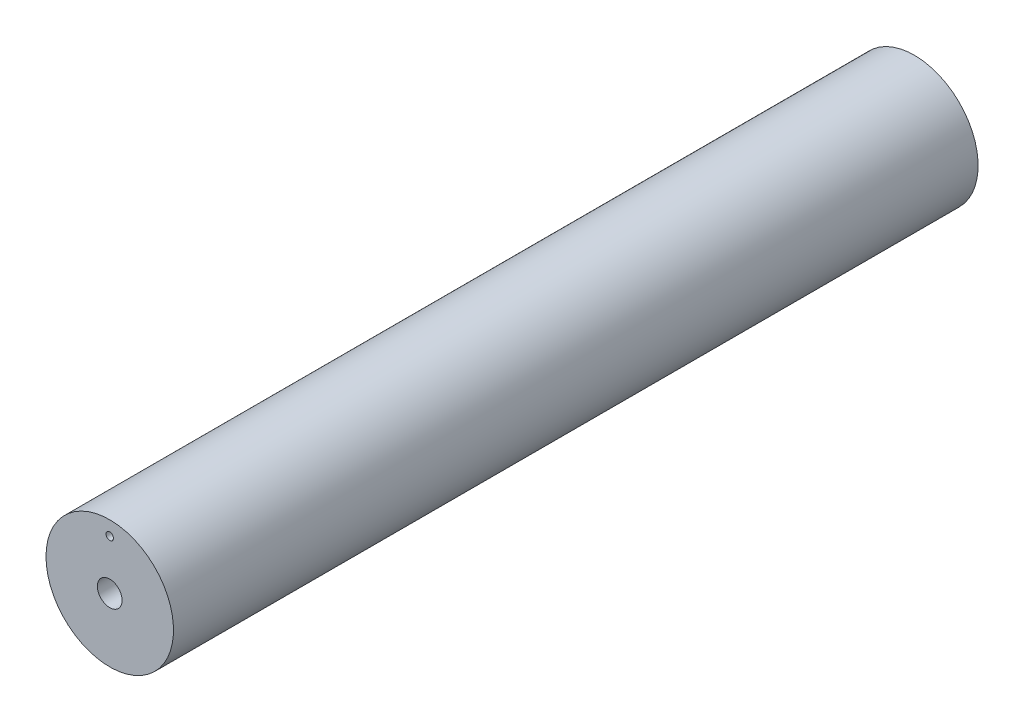
ISO-10303-21;
HEADER;
FILE_DESCRIPTION(('STEP AP214'),'2;1');
FILE_NAME('part.step','',(''),(''),'','','');
FILE_SCHEMA(('AUTOMOTIVE_DESIGN { 1 0 10303 214 1 1 1 1 }'));
ENDSEC;
DATA;
#1=APPLICATION_CONTEXT('core data for automotive mechanical design processes');
#2=APPLICATION_PROTOCOL_DEFINITION('international standard','automotive_design',2000,#1);
#3=PRODUCT_CONTEXT('',#1,'mechanical');
#4=PRODUCT('Part','Part','',(#3));
#5=PRODUCT_RELATED_PRODUCT_CATEGORY('part','',(#4));
#6=PRODUCT_DEFINITION_FORMATION('','',#4);
#7=PRODUCT_DEFINITION_CONTEXT('part definition',#1,'design');
#8=PRODUCT_DEFINITION('design','',#6,#7);
#9=PRODUCT_DEFINITION_SHAPE('','',#8);
#10=(LENGTH_UNIT() NAMED_UNIT(*) SI_UNIT(.MILLI.,.METRE.));
#11=(NAMED_UNIT(*) PLANE_ANGLE_UNIT() SI_UNIT($,.RADIAN.));
#12=(NAMED_UNIT(*) SI_UNIT($,.STERADIAN.) SOLID_ANGLE_UNIT());
#13=UNCERTAINTY_MEASURE_WITH_UNIT(LENGTH_MEASURE(1.E-05),#10,'distance_accuracy_value','');
#14=(GEOMETRIC_REPRESENTATION_CONTEXT(3) GLOBAL_UNCERTAINTY_ASSIGNED_CONTEXT((#13)) GLOBAL_UNIT_ASSIGNED_CONTEXT((#10,
#11,#12)) REPRESENTATION_CONTEXT('',''));
#15=CARTESIAN_POINT('',(0.,0.,0.));
#16=DIRECTION('',(0.,0.,1.));
#17=DIRECTION('',(1.,0.,0.));
#18=AXIS2_PLACEMENT_3D('',#15,#16,#17);
#19=CARTESIAN_POINT('',(0.,0.,-325.));
#20=DIRECTION('',(0.,0.,-1.));
#21=DIRECTION('',(-1.,0.,0.));
#22=AXIS2_PLACEMENT_3D('',#19,#20,#21);
#23=PLANE('',#22);
#24=CARTESIAN_POINT('',(0.,0.,-325.));
#25=DIRECTION('',(0.,0.,-1.));
#26=DIRECTION('',(-1.,0.,0.));
#27=AXIS2_PLACEMENT_3D('',#24,#25,#26);
#28=CIRCLE('',#27,25.75);
#29=CARTESIAN_POINT('',(-25.75,0.,-325.));
#30=VERTEX_POINT('',#29);
#31=EDGE_CURVE('E44',#30,#30,#28,.T.);
#32=ORIENTED_EDGE('',*,*,#31,.T.);
#33=EDGE_LOOP('',(#32));
#34=FACE_BOUND('',#33,.T.);
#35=ADVANCED_FACE('F34',(#34),#23,.T.);
#36=CARTESIAN_POINT('',(0.,0.,-14.8342391304348));
#37=DIRECTION('',(0.,0.,-1.));
#38=DIRECTION('',(-1.,0.,0.));
#39=AXIS2_PLACEMENT_3D('',#36,#37,#38);
#40=CYLINDRICAL_SURFACE('',#39,25.75);
#41=CARTESIAN_POINT('',(0.,-25.75,-302.5));
#42=CARTESIAN_POINT('',(-0.139071702964783,-25.7500013116466,-302.4999973531));
#43=CARTESIAN_POINT('',(-0.278109776292177,-25.7488713669522,-302.505803836122));
#44=CARTESIAN_POINT('',(-0.555227428036601,-25.7443859498667,-302.528979201853));
#45=CARTESIAN_POINT('',(-0.693306815179918,-25.7410300455616,-302.54635032851));
#46=CARTESIAN_POINT('',(-0.967538643947668,-25.7321823312999,-302.592534502752));
#47=CARTESIAN_POINT('',(-1.10369002824027,-25.7266893930699,-302.621353594603));
#48=CARTESIAN_POINT('',(-1.37307985056171,-25.7137189545468,-302.690219754531));
#49=CARTESIAN_POINT('',(-1.50631719872343,-25.7062407250305,-302.730270948612));
#50=CARTESIAN_POINT('',(-1.76871969364963,-25.6895191523797,-302.821230049703));
#51=CARTESIAN_POINT('',(-1.89788996822648,-25.6802781448668,-302.872123601263));
#52=CARTESIAN_POINT('',(-2.15150216932111,-25.66027525418,-302.984440320374));
#53=CARTESIAN_POINT('',(-2.27594233170317,-25.6495128105002,-303.045867370313));
#54=CARTESIAN_POINT('',(-2.51914759826579,-25.6267693535504,-303.178762975519));
#55=CARTESIAN_POINT('',(-2.63791526326455,-25.6147888979358,-303.250226941144));
#56=CARTESIAN_POINT('',(-2.86908862874164,-25.5899267846826,-303.402743159758));
#57=CARTESIAN_POINT('',(-2.98149193274319,-25.5770447916026,-303.483798989494));
#58=CARTESIAN_POINT('',(-3.20035618044734,-25.5505872231436,-303.65587301093));
#59=CARTESIAN_POINT('',(-3.30673728407283,-25.5370055347102,-303.746991827625));
#60=CARTESIAN_POINT('',(-3.5115088280556,-25.5096546886469,-303.937851307509));
#61=CARTESIAN_POINT('',(-3.60989629326455,-25.4958854634237,-304.03759515259));
#62=CARTESIAN_POINT('',(-3.79794271639637,-25.4685523461894,-304.244970723476));
#63=CARTESIAN_POINT('',(-3.88760421015967,-25.4549883954971,-304.352600141635));
#64=CARTESIAN_POINT('',(-4.05764520211652,-25.4284373124865,-304.575084667094));
#65=CARTESIAN_POINT('',(-4.13802126470176,-25.415450394757,-304.689942424752));
#66=CARTESIAN_POINT('',(-4.28950939220112,-25.3903241545433,-304.927053939122));
#67=CARTESIAN_POINT('',(-4.3605402191834,-25.3781926424184,-305.049360551553));
#68=CARTESIAN_POINT('',(-4.49204913499954,-25.3552446717865,-305.299654417956));
#69=CARTESIAN_POINT('',(-4.55252326806184,-25.3444287066957,-305.427643778911));
#70=CARTESIAN_POINT('',(-4.71731205224291,-25.314464242445,-305.818701474918));
#71=CARTESIAN_POINT('',(-4.80517531064589,-25.2977677471176,-306.089144949432));
#72=CARTESIAN_POINT('',(-4.93306312220185,-25.2731400173587,-306.637812678647));
#73=CARTESIAN_POINT('',(-4.97366644611287,-25.265102829092,-306.915899159868));
#74=CARTESIAN_POINT('',(-5.00777123190432,-25.2583659935788,-307.475083687307));
#75=CARTESIAN_POINT('',(-5.00127722844938,-25.2596654473739,-307.756181440989));
#76=CARTESIAN_POINT('',(-4.94181453620318,-25.2713639060047,-308.309154637769));
#77=CARTESIAN_POINT('',(-4.88950579811801,-25.2816336896089,-308.581104322402));
#78=CARTESIAN_POINT('',(-4.74094565727144,-25.3099111069183,-309.112295901449));
#79=CARTESIAN_POINT('',(-4.64469226511212,-25.3279190909337,-309.37153721996));
#80=CARTESIAN_POINT('',(-4.41033605515574,-25.3697777182777,-309.871865346244));
#81=CARTESIAN_POINT('',(-4.27196936833475,-25.3936650135976,-310.112825359713));
#82=CARTESIAN_POINT('',(-3.95750114280775,-25.4445668117896,-310.568355425115));
#83=CARTESIAN_POINT('',(-3.78139550697966,-25.4715816540567,-310.782922607732));
#84=CARTESIAN_POINT('',(-3.39290348552816,-25.5262559649861,-311.183385996852));
#85=CARTESIAN_POINT('',(-3.17995332274382,-25.5539186038657,-311.368735279338));
#86=CARTESIAN_POINT('',(-2.72569680039366,-25.6063520819381,-311.701165378236));
#87=CARTESIAN_POINT('',(-2.48439011608602,-25.6311228880069,-311.848245756327));
#88=CARTESIAN_POINT('',(-1.97968037220439,-25.6750373130634,-312.100054350294));
#89=CARTESIAN_POINT('',(-1.71624671660338,-25.6941729697828,-312.2047227172));
#90=CARTESIAN_POINT('',(-1.17508103937554,-25.7246000984149,-312.368167327732));
#91=CARTESIAN_POINT('',(-0.897350652497407,-25.7358924650319,-312.42694880589));
#92=CARTESIAN_POINT('',(-0.340177753465008,-25.7492368756057,-312.496182919513));
#93=CARTESIAN_POINT('',(-0.0608316192947009,-25.7514320923749,-312.507384448974));
#94=CARTESIAN_POINT('',(0.495741349085695,-25.7467315013665,-312.483153751129));
#95=CARTESIAN_POINT('',(0.772968294518511,-25.7398361740347,-312.44772398834));
#96=CARTESIAN_POINT('',(1.31503667191646,-25.7178186456734,-312.331858851279));
#97=CARTESIAN_POINT('',(1.57996278314829,-25.7027662552858,-312.251805217655));
#98=CARTESIAN_POINT('',(2.0926323368361,-25.6661158145726,-312.049379926549));
#99=CARTESIAN_POINT('',(2.34037454651603,-25.6445172952221,-311.92700523671));
#100=CARTESIAN_POINT('',(2.81482008763869,-25.5968134589814,-311.641774056588));
#101=CARTESIAN_POINT('',(3.04124536386352,-25.5706586696731,-311.478463505666));
#102=CARTESIAN_POINT('',(3.46374603978376,-25.5168651192006,-311.116606397966));
#103=CARTESIAN_POINT('',(3.65981838147855,-25.4892262088915,-310.918056295191));
#104=CARTESIAN_POINT('',(4.01891696301251,-25.435100320386,-310.487959561623));
#105=CARTESIAN_POINT('',(4.18143050635239,-25.4086354688307,-310.255981652019));
#106=CARTESIAN_POINT('',(4.46518411642672,-25.3603122810486,-309.767568444024));
#107=CARTESIAN_POINT('',(4.5864257819735,-25.3384537663913,-309.511134093532));
#108=CARTESIAN_POINT('',(4.78348560632307,-25.3019921273503,-308.982397386735));
#109=CARTESIAN_POINT('',(4.85953180150831,-25.2873526438189,-308.710182430545));
#110=CARTESIAN_POINT('',(4.96472324330215,-25.2669153539056,-308.156368626682));
#111=CARTESIAN_POINT('',(4.99387421236058,-25.2611164687429,-307.874770928231));
#112=CARTESIAN_POINT('',(5.00172291738038,-25.2595555939966,-307.454391691945));
#113=CARTESIAN_POINT('',(4.99852809334833,-25.2601913423189,-307.315729864244));
#114=CARTESIAN_POINT('',(4.98064396663257,-25.2637250238439,-307.03919260154));
#115=CARTESIAN_POINT('',(4.96595901754446,-25.2666221002308,-306.901316888606));
#116=CARTESIAN_POINT('',(4.92519805217514,-25.2745988189417,-306.627285193534));
#117=CARTESIAN_POINT('',(4.89911803379237,-25.2796792280711,-306.491129832911));
#118=CARTESIAN_POINT('',(4.83578465462418,-25.2918707743678,-306.221585827104));
#119=CARTESIAN_POINT('',(4.79853528629988,-25.2989811858716,-306.088196211496));
#120=CARTESIAN_POINT('',(4.71322173888286,-25.3150137000267,-305.825304420051));
#121=CARTESIAN_POINT('',(4.66517731088508,-25.3239324911183,-305.695795628082));
#122=CARTESIAN_POINT('',(4.55861132393383,-25.3433323178662,-305.441339732487));
#123=CARTESIAN_POINT('',(4.50009348022964,-25.353812799322,-305.316391030115));
#124=CARTESIAN_POINT('',(4.37296410989272,-25.3760487133338,-305.071792732663));
#125=CARTESIAN_POINT('',(4.30434843599025,-25.3878046692149,-304.952145341274));
#126=CARTESIAN_POINT('',(4.15754710213744,-25.41225757391,-304.719034535688));
#127=CARTESIAN_POINT('',(4.07936474142331,-25.4249541977259,-304.60556900897));
#128=CARTESIAN_POINT('',(3.91258428603535,-25.4511576087576,-304.383710915252));
#129=CARTESIAN_POINT('',(3.8238363328589,-25.4646742711982,-304.275432139106));
#130=CARTESIAN_POINT('',(3.63762703697678,-25.4919402590532,-304.066748068896));
#131=CARTESIAN_POINT('',(3.5401687758845,-25.5056895007987,-303.966340013671));
#132=CARTESIAN_POINT('',(3.33711123121151,-25.5330508804669,-303.773975440119));
#133=CARTESIAN_POINT('',(3.23150715666628,-25.5466629322978,-303.682023966309));
#134=CARTESIAN_POINT('',(3.01296063594732,-25.5733588007866,-303.507302439853));
#135=CARTESIAN_POINT('',(2.9000209065648,-25.5864428101293,-303.424529018476));
#136=CARTESIAN_POINT('',(2.66634527401277,-25.6118537326256,-303.267909994996));
#137=CARTESIAN_POINT('',(2.54554179092353,-25.6241715976715,-303.194163699936));
#138=CARTESIAN_POINT('',(2.29807145537,-25.6475497575088,-303.057155786861));
#139=CARTESIAN_POINT('',(2.17140677765533,-25.6586105135585,-302.993890319297));
#140=CARTESIAN_POINT('',(1.91313701224409,-25.6791582551659,-302.878322323272));
#141=CARTESIAN_POINT('',(1.78153505961433,-25.6886462193464,-302.826012972314));
#142=CARTESIAN_POINT('',(1.5143047670375,-25.7057838274082,-302.732724409073));
#143=CARTESIAN_POINT('',(1.37867722534381,-25.7134338330469,-302.691742966927));
#144=CARTESIAN_POINT('',(1.03911071429955,-25.7298212981353,-302.604711173685));
#145=CARTESIAN_POINT('',(0.833319751811297,-25.737349779091,-302.565496715176));
#146=CARTESIAN_POINT('',(0.418327113195695,-25.7474380725385,-302.513143492661));
#147=CARTESIAN_POINT('',(0.209125535139197,-25.7499980276449,-302.500003980209));
#148=CARTESIAN_POINT('',(0.,-25.75,-302.5));
#149=B_SPLINE_CURVE_WITH_KNOTS('',3,(#41,#42,#43,#44,#45,#46,#47,#48,#49,#50,#51,#52,#53,#54,
#55,#56,#57,#58,#59,#60,#61,#62,#63,#64,#65,#66,#67,#68,#69,#70,#71,#72,#73,#74,#75,#76,#77,#78,
#79,#80,#81,#82,#83,#84,#85,#86,#87,#88,#89,#90,#91,#92,#93,#94,#95,#96,#97,#98,#99,#100,#101,
#102,#103,#104,#105,#106,#107,#108,#109,#110,#111,#112,#113,#114,#115,#116,#117,#118,#119,#120,
#121,#122,#123,#124,#125,#126,#127,#128,#129,#130,#131,#132,#133,#134,#135,#136,#137,#138,#139,
#140,#141,#142,#143,#144,#145,#146,#147,#148),.UNSPECIFIED.,.T.,.F.,(4,2,2,2,2,2,2,2,2,2,2,2,2,
2,2,2,2,2,2,2,2,2,2,2,2,2,2,2,2,2,2,2,2,2,2,2,2,2,2,2,2,2,2,2,2,2,2,2,2,2,2,2,2,4),(0.,
0.417031545663293,0.834144033697418,1.25147704090893,1.668963552528,2.08590070313774,
2.5029918580425,2.91989290433021,3.33694990323126,3.75863775053231,4.18048183342258,
4.60220295650927,5.02407961996289,5.44941043564116,5.87490028943208,6.72487260183453,
7.56432237061746,8.40369131586239,9.23116459536586,10.0586753387408,10.8914816464059,
11.7243784133807,12.5713766810536,13.4183846495839,14.2665837306903,15.114686039633,
15.9493888341824,16.7840475154988,17.6116732173783,18.4393582319889,19.2766650299604,
20.1140561301814,20.9634228418877,21.8127566466215,22.6577678828744,23.502675997729,
23.918370252033,24.3339070764738,24.7495899604945,25.1651244362914,25.5799047357766,
25.9945381902431,26.4093424161312,26.8240039907153,27.245469627568,27.6667867402335,
28.0883535684397,28.5097651481185,28.935460496185,29.3609991404467,29.7862720039833,
30.2114610942148,30.838579671937,31.465680248816),.UNSPECIFIED.);
#150=CARTESIAN_POINT('',(0.,-25.75,-302.5));
#151=VERTEX_POINT('',#150);
#152=EDGE_CURVE('E10',#151,#151,#149,.T.);
#153=ORIENTED_EDGE('',*,*,#152,.F.);
#154=EDGE_LOOP('',(#153));
#155=FACE_BOUND('',#154,.T.);
#156=CARTESIAN_POINT('',(0.,0.,0.));
#157=DIRECTION('',(0.,0.,-1.));
#158=DIRECTION('',(-1.,0.,0.));
#159=AXIS2_PLACEMENT_3D('',#156,#157,#158);
#160=CIRCLE('',#159,25.75);
#161=CARTESIAN_POINT('',(-25.75,0.,0.));
#162=VERTEX_POINT('',#161);
#163=EDGE_CURVE('E48',#162,#162,#160,.T.);
#164=ORIENTED_EDGE('',*,*,#163,.T.);
#165=EDGE_LOOP('',(#164));
#166=FACE_BOUND('',#165,.T.);
#167=ORIENTED_EDGE('',*,*,#31,.F.);
#168=EDGE_LOOP('',(#167));
#169=FACE_BOUND('',#168,.T.);
#170=ADVANCED_FACE('F83',(#155,#166,#169),#40,.T.);
#171=CARTESIAN_POINT('',(-25.75,0.,0.));
#172=DIRECTION('',(0.,0.,1.));
#173=DIRECTION('',(1.,0.,0.));
#174=AXIS2_PLACEMENT_3D('',#171,#172,#173);
#175=PLANE('',#174);
#176=CARTESIAN_POINT('',(0.,20.,0.));
#177=DIRECTION('',(0.,0.,1.));
#178=DIRECTION('',(1.,0.,0.));
#179=AXIS2_PLACEMENT_3D('',#176,#177,#178);
#180=CIRCLE('',#179,1.5);
#181=CARTESIAN_POINT('',(1.5,20.,0.));
#182=VERTEX_POINT('',#181);
#183=EDGE_CURVE('E64',#182,#182,#180,.T.);
#184=ORIENTED_EDGE('',*,*,#183,.F.);
#185=EDGE_LOOP('',(#184));
#186=FACE_BOUND('',#185,.T.);
#187=CARTESIAN_POINT('',(0.,0.,0.));
#188=DIRECTION('',(0.,0.,-1.));
#189=DIRECTION('',(-1.,0.,0.));
#190=AXIS2_PLACEMENT_3D('',#187,#188,#189);
#191=CIRCLE('',#190,5.);
#192=CARTESIAN_POINT('',(-5.,0.,0.));
#193=VERTEX_POINT('',#192);
#194=EDGE_CURVE('E52',#193,#193,#191,.T.);
#195=ORIENTED_EDGE('',*,*,#194,.T.);
#196=EDGE_LOOP('',(#195));
#197=FACE_BOUND('',#196,.T.);
#198=ORIENTED_EDGE('',*,*,#163,.F.);
#199=EDGE_LOOP('',(#198));
#200=FACE_BOUND('',#199,.T.);
#201=ADVANCED_FACE('F79',(#186,#197,#200),#175,.T.);
#202=CARTESIAN_POINT('',(0.,0.,-14.8342391304348));
#203=DIRECTION('',(0.,0.,-1.));
#204=DIRECTION('',(-1.,0.,0.));
#205=AXIS2_PLACEMENT_3D('',#202,#203,#204);
#206=CYLINDRICAL_SURFACE('',#205,5.);
#207=CARTESIAN_POINT('',(0.,0.,-25.));
#208=DIRECTION('',(0.,0.,-1.));
#209=DIRECTION('',(-1.,0.,0.));
#210=AXIS2_PLACEMENT_3D('',#207,#208,#209);
#211=CIRCLE('',#210,5.);
#212=CARTESIAN_POINT('',(-5.,0.,-25.));
#213=VERTEX_POINT('',#212);
#214=EDGE_CURVE('E57',#213,#213,#211,.T.);
#215=ORIENTED_EDGE('',*,*,#214,.T.);
#216=EDGE_LOOP('',(#215));
#217=FACE_BOUND('',#216,.T.);
#218=ORIENTED_EDGE('',*,*,#194,.F.);
#219=EDGE_LOOP('',(#218));
#220=FACE_BOUND('',#219,.T.);
#221=ADVANCED_FACE('F82',(#217,#220),#206,.F.);
#222=CARTESIAN_POINT('',(-5.,0.,-25.));
#223=DIRECTION('',(0.,0.,1.));
#224=DIRECTION('',(1.,0.,0.));
#225=AXIS2_PLACEMENT_3D('',#222,#223,#224);
#226=PLANE('',#225);
#227=ORIENTED_EDGE('',*,*,#214,.F.);
#228=EDGE_LOOP('',(#227));
#229=FACE_BOUND('',#228,.T.);
#230=ADVANCED_FACE('F99',(#229),#226,.T.);
#231=CARTESIAN_POINT('',(0.,-25.75,-307.5));
#232=DIRECTION('',(0.,1.,0.));
#233=DIRECTION('',(0.,0.,1.));
#234=AXIS2_PLACEMENT_3D('',#231,#232,#233);
#235=CYLINDRICAL_SURFACE('',#234,5.);
#236=ORIENTED_EDGE('',*,*,#152,.T.);
#237=EDGE_LOOP('',(#236));
#238=FACE_BOUND('',#237,.T.);
#239=CARTESIAN_POINT('',(0.,0.,-307.5));
#240=DIRECTION('',(0.,1.,0.));
#241=DIRECTION('',(0.,0.,1.));
#242=AXIS2_PLACEMENT_3D('',#239,#240,#241);
#243=CIRCLE('',#242,5.);
#244=CARTESIAN_POINT('',(0.,0.,-302.5));
#245=VERTEX_POINT('',#244);
#246=EDGE_CURVE('E60',#245,#245,#243,.T.);
#247=ORIENTED_EDGE('',*,*,#246,.T.);
#248=EDGE_LOOP('',(#247));
#249=FACE_BOUND('',#248,.T.);
#250=ADVANCED_FACE('F102',(#238,#249),#235,.F.);
#251=CARTESIAN_POINT('',(0.,0.,-307.5));
#252=DIRECTION('',(0.,1.,0.));
#253=DIRECTION('',(0.,0.,1.));
#254=AXIS2_PLACEMENT_3D('',#251,#252,#253);
#255=PLANE('',#254);
#256=ORIENTED_EDGE('',*,*,#246,.F.);
#257=EDGE_LOOP('',(#256));
#258=FACE_BOUND('',#257,.T.);
#259=ADVANCED_FACE('F75',(#258),#255,.F.);
#260=CARTESIAN_POINT('',(0.,20.,-10.));
#261=DIRECTION('',(0.,0.,1.));
#262=DIRECTION('',(1.,0.,0.));
#263=AXIS2_PLACEMENT_3D('',#260,#261,#262);
#264=CYLINDRICAL_SURFACE('',#263,1.5);
#265=CARTESIAN_POINT('',(0.,20.,-10.));
#266=DIRECTION('',(0.,0.,1.));
#267=DIRECTION('',(1.,0.,0.));
#268=AXIS2_PLACEMENT_3D('',#265,#266,#267);
#269=CIRCLE('',#268,1.5);
#270=CARTESIAN_POINT('',(1.5,20.,-10.));
#271=VERTEX_POINT('',#270);
#272=EDGE_CURVE('E63',#271,#271,#269,.T.);
#273=ORIENTED_EDGE('',*,*,#272,.F.);
#274=EDGE_LOOP('',(#273));
#275=FACE_BOUND('',#274,.T.);
#276=ORIENTED_EDGE('',*,*,#183,.T.);
#277=EDGE_LOOP('',(#276));
#278=FACE_BOUND('',#277,.T.);
#279=ADVANCED_FACE('F72',(#275,#278),#264,.F.);
#280=CARTESIAN_POINT('',(0.,20.,-10.));
#281=DIRECTION('',(0.,0.,1.));
#282=DIRECTION('',(1.,0.,0.));
#283=AXIS2_PLACEMENT_3D('',#280,#281,#282);
#284=PLANE('',#283);
#285=ORIENTED_EDGE('',*,*,#272,.T.);
#286=EDGE_LOOP('',(#285));
#287=FACE_BOUND('',#286,.T.);
#288=ADVANCED_FACE('F70',(#287),#284,.T.);
#289=CLOSED_SHELL('',(#35,#170,#201,#221,#230,#250,#259,#279,#288));
#290=MANIFOLD_SOLID_BREP('B2',#289);
#291=ADVANCED_BREP_SHAPE_REPRESENTATION('',(#18,#290),#14);
#292=SHAPE_DEFINITION_REPRESENTATION(#9,#291);
ENDSEC;
END-ISO-10303-21;
